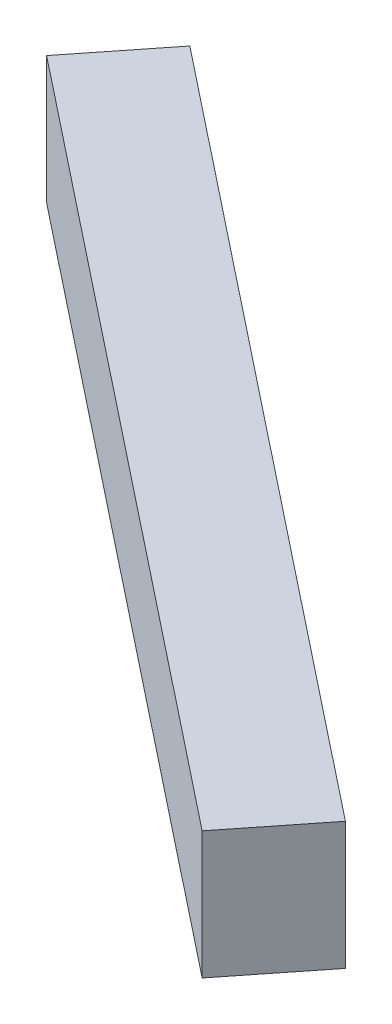
ISO-10303-21;
HEADER;
FILE_DESCRIPTION(('STEP AP214'),'2;1');
FILE_NAME('part.step','',(''),(''),'','','');
FILE_SCHEMA(('AUTOMOTIVE_DESIGN { 1 0 10303 214 1 1 1 1 }'));
ENDSEC;
DATA;
#1=APPLICATION_CONTEXT('core data for automotive mechanical design processes');
#2=APPLICATION_PROTOCOL_DEFINITION('international standard','automotive_design',2000,#1);
#3=PRODUCT_CONTEXT('',#1,'mechanical');
#4=PRODUCT('Part','Part','',(#3));
#5=PRODUCT_RELATED_PRODUCT_CATEGORY('part','',(#4));
#6=PRODUCT_DEFINITION_FORMATION('','',#4);
#7=PRODUCT_DEFINITION_CONTEXT('part definition',#1,'design');
#8=PRODUCT_DEFINITION('design','',#6,#7);
#9=PRODUCT_DEFINITION_SHAPE('','',#8);
#10=(LENGTH_UNIT() NAMED_UNIT(*) SI_UNIT(.MILLI.,.METRE.));
#11=(NAMED_UNIT(*) PLANE_ANGLE_UNIT() SI_UNIT($,.RADIAN.));
#12=(NAMED_UNIT(*) SI_UNIT($,.STERADIAN.) SOLID_ANGLE_UNIT());
#13=UNCERTAINTY_MEASURE_WITH_UNIT(LENGTH_MEASURE(1.E-05),#10,'distance_accuracy_value','');
#14=(GEOMETRIC_REPRESENTATION_CONTEXT(3) GLOBAL_UNCERTAINTY_ASSIGNED_CONTEXT((#13)) GLOBAL_UNIT_ASSIGNED_CONTEXT((#10,
#11,#12)) REPRESENTATION_CONTEXT('',''));
#15=CARTESIAN_POINT('',(0.,0.,0.));
#16=DIRECTION('',(0.,0.,1.));
#17=DIRECTION('',(1.,0.,0.));
#18=AXIS2_PLACEMENT_3D('',#15,#16,#17);
#19=CARTESIAN_POINT('',(14.1691973788125,7.874,11.0981077592051));
#20=DIRECTION('',(-0.621038349973673,0.,0.783780178278309));
#21=DIRECTION('',(0.783780178278309,0.,0.621038349973673));
#22=AXIS2_PLACEMENT_3D('',#19,#20,#21);
#23=PLANE('',#22);
#24=DIRECTION('',(0.,1.,0.));
#25=VECTOR('',#24,1.);
#26=CARTESIAN_POINT('',(14.1691973788125,7.874,11.0981077592051));
#27=LINE('',#26,#25);
#28=CARTESIAN_POINT('',(14.1691973788125,7.62,11.0981077592051));
#29=VERTEX_POINT('',#28);
#30=CARTESIAN_POINT('',(14.1691973788125,7.874,11.0981077592051));
#31=VERTEX_POINT('',#30);
#32=EDGE_CURVE('E20',#29,#31,#27,.T.);
#33=ORIENTED_EDGE('',*,*,#32,.T.);
#34=DIRECTION('',(0.783780178278325,0.,0.621038349973652));
#35=VECTOR('',#34,1.);
#36=CARTESIAN_POINT('',(14.1691973788125,7.874,11.0981077592051));
#37=LINE('',#36,#35);
#38=CARTESIAN_POINT('',(15.6622986184327,7.874,12.2811858159049));
#39=VERTEX_POINT('',#38);
#40=EDGE_CURVE('E55',#31,#39,#37,.T.);
#41=ORIENTED_EDGE('',*,*,#40,.T.);
#42=DIRECTION('',(0.,1.,0.));
#43=VECTOR('',#42,1.);
#44=CARTESIAN_POINT('',(15.6622986184327,7.874,12.2811858159049));
#45=LINE('',#44,#43);
#46=CARTESIAN_POINT('',(15.6622986184327,7.62,12.2811858159049));
#47=VERTEX_POINT('',#46);
#48=EDGE_CURVE('E76',#39,#47,#45,.F.);
#49=ORIENTED_EDGE('',*,*,#48,.T.);
#50=DIRECTION('',(0.783780178278325,0.,0.621038349973652));
#51=VECTOR('',#50,1.);
#52=CARTESIAN_POINT('',(14.1691973788125,7.62,11.0981077592051));
#53=LINE('',#52,#51);
#54=EDGE_CURVE('E58',#29,#47,#53,.T.);
#55=ORIENTED_EDGE('',*,*,#54,.F.);
#56=EDGE_LOOP('',(#33,#41,#49,#55));
#57=FACE_BOUND('',#56,.T.);
#58=ADVANCED_FACE('F17',(#57),#23,.F.);
#59=CARTESIAN_POINT('',(14.1691973788125,7.874,11.0981077592051));
#60=DIRECTION('',(0.783780178278334,0.,0.621038349973641));
#61=DIRECTION('',(0.621038349973641,0.,-0.783780178278334));
#62=AXIS2_PLACEMENT_3D('',#59,#60,#61);
#63=PLANE('',#62);
#64=DIRECTION('',(0.,1.,0.));
#65=VECTOR('',#64,1.);
#66=CARTESIAN_POINT('',(14.0430023860979,7.874,11.2573718914312));
#67=LINE('',#66,#65);
#68=CARTESIAN_POINT('',(14.0430023860979,7.62,11.2573718914312));
#69=VERTEX_POINT('',#68);
#70=CARTESIAN_POINT('',(14.0430023860979,7.874,11.2573718914312));
#71=VERTEX_POINT('',#70);
#72=EDGE_CURVE('E73',#69,#71,#67,.T.);
#73=ORIENTED_EDGE('',*,*,#72,.T.);
#74=DIRECTION('',(0.621038349973642,0.,-0.783780178278333));
#75=VECTOR('',#74,1.);
#76=CARTESIAN_POINT('',(14.0430023860979,7.874,11.2573718914312));
#77=LINE('',#76,#75);
#78=EDGE_CURVE('E63',#71,#31,#77,.T.);
#79=ORIENTED_EDGE('',*,*,#78,.T.);
#80=ORIENTED_EDGE('',*,*,#32,.F.);
#81=DIRECTION('',(0.621038349973642,0.,-0.783780178278333));
#82=VECTOR('',#81,1.);
#83=CARTESIAN_POINT('',(14.0430023860979,7.62,11.2573718914312));
#84=LINE('',#83,#82);
#85=EDGE_CURVE('E80',#69,#29,#84,.T.);
#86=ORIENTED_EDGE('',*,*,#85,.F.);
#87=EDGE_LOOP('',(#73,#79,#80,#86));
#88=FACE_BOUND('',#87,.T.);
#89=ADVANCED_FACE('F72',(#88),#63,.F.);
#90=CARTESIAN_POINT('',(14.1691973788125,7.874,11.0981077592051));
#91=DIRECTION('',(0.,-1.,0.));
#92=DIRECTION('',(0.,0.,-1.));
#93=AXIS2_PLACEMENT_3D('',#90,#91,#92);
#94=PLANE('',#93);
#95=ORIENTED_EDGE('',*,*,#78,.F.);
#96=DIRECTION('',(-0.783780178278307,0.,-0.621038349973675));
#97=VECTOR('',#96,1.);
#98=CARTESIAN_POINT('',(14.0430023860979,7.874,11.2573718914312));
#99=LINE('',#98,#97);
#100=CARTESIAN_POINT('',(15.5361036259605,7.874,12.4404499483232));
#101=VERTEX_POINT('',#100);
#102=EDGE_CURVE('E83',#71,#101,#99,.F.);
#103=ORIENTED_EDGE('',*,*,#102,.T.);
#104=DIRECTION('',(-0.621038348780532,0.,0.78378017922371));
#105=VECTOR('',#104,1.);
#106=CARTESIAN_POINT('',(15.6622986184327,7.874,12.2811858159049));
#107=LINE('',#106,#105);
#108=EDGE_CURVE('E69',#101,#39,#107,.F.);
#109=ORIENTED_EDGE('',*,*,#108,.T.);
#110=ORIENTED_EDGE('',*,*,#40,.F.);
#111=EDGE_LOOP('',(#95,#103,#109,#110));
#112=FACE_BOUND('',#111,.T.);
#113=ADVANCED_FACE('F66',(#112),#94,.F.);
#114=CARTESIAN_POINT('',(15.6622986184327,7.874,12.2811858159049));
#115=DIRECTION('',(-0.78378017922371,0.,-0.621038348780532));
#116=DIRECTION('',(-0.621038348780532,0.,0.78378017922371));
#117=AXIS2_PLACEMENT_3D('',#114,#115,#116);
#118=PLANE('',#117);
#119=ORIENTED_EDGE('',*,*,#48,.F.);
#120=ORIENTED_EDGE('',*,*,#108,.F.);
#121=DIRECTION('',(0.,1.,0.));
#122=VECTOR('',#121,1.);
#123=CARTESIAN_POINT('',(15.5361036259605,7.874,12.4404499483232));
#124=LINE('',#123,#122);
#125=CARTESIAN_POINT('',(15.5361036259605,7.62,12.4404499483232));
#126=VERTEX_POINT('',#125);
#127=EDGE_CURVE('E26',#101,#126,#124,.F.);
#128=ORIENTED_EDGE('',*,*,#127,.T.);
#129=DIRECTION('',(-0.621038348780423,0.,0.783780179223796));
#130=VECTOR('',#129,1.);
#131=CARTESIAN_POINT('',(15.6622986184327,7.62,12.2811858159049));
#132=LINE('',#131,#130);
#133=EDGE_CURVE('E34',#47,#126,#132,.T.);
#134=ORIENTED_EDGE('',*,*,#133,.F.);
#135=EDGE_LOOP('',(#119,#120,#128,#134));
#136=FACE_BOUND('',#135,.T.);
#137=ADVANCED_FACE('F88',(#136),#118,.F.);
#138=CARTESIAN_POINT('',(14.1691973788125,7.62,11.0981077592051));
#139=DIRECTION('',(0.,-1.,0.));
#140=DIRECTION('',(0.,0.,-1.));
#141=AXIS2_PLACEMENT_3D('',#138,#139,#140);
#142=PLANE('',#141);
#143=DIRECTION('',(-0.783780178278307,0.,-0.621038349973675));
#144=VECTOR('',#143,1.);
#145=CARTESIAN_POINT('',(14.0430023860979,7.62,11.2573718914312));
#146=LINE('',#145,#144);
#147=EDGE_CURVE('E11',#126,#69,#146,.T.);
#148=ORIENTED_EDGE('',*,*,#147,.T.);
#149=ORIENTED_EDGE('',*,*,#85,.T.);
#150=ORIENTED_EDGE('',*,*,#54,.T.);
#151=ORIENTED_EDGE('',*,*,#133,.T.);
#152=EDGE_LOOP('',(#148,#149,#150,#151));
#153=FACE_BOUND('',#152,.T.);
#154=ADVANCED_FACE('F91',(#153),#142,.T.);
#155=CARTESIAN_POINT('',(14.0430023860979,7.874,11.2573718914312));
#156=DIRECTION('',(0.621038349973675,0.,-0.783780178278307));
#157=DIRECTION('',(-0.783780178278307,0.,-0.621038349973675));
#158=AXIS2_PLACEMENT_3D('',#155,#156,#157);
#159=PLANE('',#158);
#160=ORIENTED_EDGE('',*,*,#127,.F.);
#161=ORIENTED_EDGE('',*,*,#102,.F.);
#162=ORIENTED_EDGE('',*,*,#72,.F.);
#163=ORIENTED_EDGE('',*,*,#147,.F.);
#164=EDGE_LOOP('',(#160,#161,#162,#163));
#165=FACE_BOUND('',#164,.T.);
#166=ADVANCED_FACE('F90',(#165),#159,.F.);
#167=CLOSED_SHELL('',(#58,#89,#113,#137,#154,#166));
#168=MANIFOLD_SOLID_BREP('B1',#167);
#169=ADVANCED_BREP_SHAPE_REPRESENTATION('',(#18,#168),#14);
#170=SHAPE_DEFINITION_REPRESENTATION(#9,#169);
ENDSEC;
END-ISO-10303-21;
